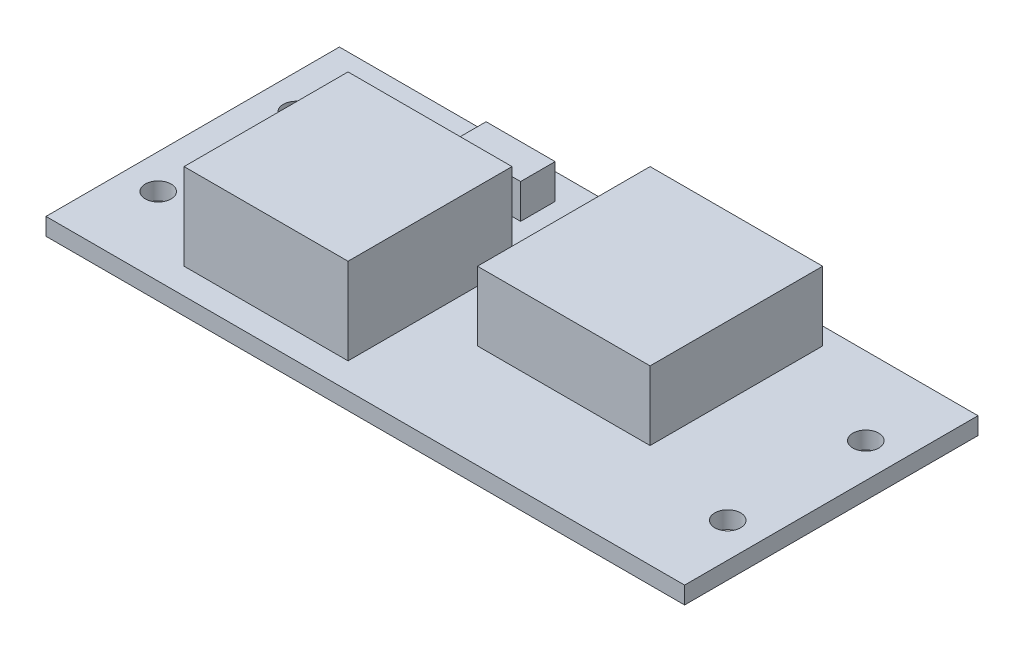
ISO-10303-21;
HEADER;
FILE_DESCRIPTION(('STEP AP214'),'2;1');
FILE_NAME('part.step','',(''),(''),'','','');
FILE_SCHEMA(('AUTOMOTIVE_DESIGN { 1 0 10303 214 1 1 1 1 }'));
ENDSEC;
DATA;
#1=APPLICATION_CONTEXT('core data for automotive mechanical design processes');
#2=APPLICATION_PROTOCOL_DEFINITION('international standard','automotive_design',2000,#1);
#3=PRODUCT_CONTEXT('',#1,'mechanical');
#4=PRODUCT('Part','Part','',(#3));
#5=PRODUCT_RELATED_PRODUCT_CATEGORY('part','',(#4));
#6=PRODUCT_DEFINITION_FORMATION('','',#4);
#7=PRODUCT_DEFINITION_CONTEXT('part definition',#1,'design');
#8=PRODUCT_DEFINITION('design','',#6,#7);
#9=PRODUCT_DEFINITION_SHAPE('','',#8);
#10=(LENGTH_UNIT() NAMED_UNIT(*) SI_UNIT(.MILLI.,.METRE.));
#11=(NAMED_UNIT(*) PLANE_ANGLE_UNIT() SI_UNIT($,.RADIAN.));
#12=(NAMED_UNIT(*) SI_UNIT($,.STERADIAN.) SOLID_ANGLE_UNIT());
#13=UNCERTAINTY_MEASURE_WITH_UNIT(LENGTH_MEASURE(1.E-05),#10,'distance_accuracy_value','');
#14=(GEOMETRIC_REPRESENTATION_CONTEXT(3) GLOBAL_UNCERTAINTY_ASSIGNED_CONTEXT((#13)) GLOBAL_UNIT_ASSIGNED_CONTEXT((#10,
#11,#12)) REPRESENTATION_CONTEXT('',''));
#15=CARTESIAN_POINT('',(0.,0.,0.));
#16=DIRECTION('',(0.,0.,1.));
#17=DIRECTION('',(1.,0.,0.));
#18=AXIS2_PLACEMENT_3D('',#15,#16,#17);
#19=CARTESIAN_POINT('',(18.5,-1.,0.));
#20=DIRECTION('',(-1.,0.,0.));
#21=DIRECTION('',(0.,0.,1.));
#22=AXIS2_PLACEMENT_3D('',#19,#20,#21);
#23=PLANE('',#22);
#24=DIRECTION('',(0.,0.,1.));
#25=VECTOR('',#24,1.);
#26=CARTESIAN_POINT('',(18.5,0.,0.));
#27=LINE('',#26,#25);
#28=CARTESIAN_POINT('',(18.5,0.,-8.5));
#29=VERTEX_POINT('',#28);
#30=CARTESIAN_POINT('',(18.5,0.,8.5));
#31=VERTEX_POINT('',#30);
#32=EDGE_CURVE('E282',#29,#31,#27,.T.);
#33=ORIENTED_EDGE('',*,*,#32,.T.);
#34=DIRECTION('',(0.,1.,0.));
#35=VECTOR('',#34,1.);
#36=CARTESIAN_POINT('',(18.5,-1.,8.5));
#37=LINE('',#36,#35);
#38=CARTESIAN_POINT('',(18.5,-1.,8.5));
#39=VERTEX_POINT('',#38);
#40=EDGE_CURVE('E11',#39,#31,#37,.T.);
#41=ORIENTED_EDGE('',*,*,#40,.F.);
#42=DIRECTION('',(0.,0.,1.));
#43=VECTOR('',#42,1.);
#44=CARTESIAN_POINT('',(18.5,-1.,0.));
#45=LINE('',#44,#43);
#46=CARTESIAN_POINT('',(18.5,-1.,-8.5));
#47=VERTEX_POINT('',#46);
#48=EDGE_CURVE('E261',#47,#39,#45,.T.);
#49=ORIENTED_EDGE('',*,*,#48,.F.);
#50=DIRECTION('',(0.,1.,0.));
#51=VECTOR('',#50,1.);
#52=CARTESIAN_POINT('',(18.5,-1.,-8.5));
#53=LINE('',#52,#51);
#54=EDGE_CURVE('E39',#47,#29,#53,.T.);
#55=ORIENTED_EDGE('',*,*,#54,.T.);
#56=EDGE_LOOP('',(#33,#41,#49,#55));
#57=FACE_BOUND('',#56,.T.);
#58=ADVANCED_FACE('F35',(#57),#23,.F.);
#59=CARTESIAN_POINT('',(0.,-1.,8.5));
#60=DIRECTION('',(0.,0.,1.));
#61=DIRECTION('',(1.,0.,0.));
#62=AXIS2_PLACEMENT_3D('',#59,#60,#61);
#63=PLANE('',#62);
#64=DIRECTION('',(1.,0.,0.));
#65=VECTOR('',#64,1.);
#66=CARTESIAN_POINT('',(0.,0.,8.5));
#67=LINE('',#66,#65);
#68=CARTESIAN_POINT('',(-18.5,0.,8.5));
#69=VERTEX_POINT('',#68);
#70=EDGE_CURVE('E252',#69,#31,#67,.T.);
#71=ORIENTED_EDGE('',*,*,#70,.F.);
#72=DIRECTION('',(0.,1.,0.));
#73=VECTOR('',#72,1.);
#74=CARTESIAN_POINT('',(-18.5,-1.,8.5));
#75=LINE('',#74,#73);
#76=CARTESIAN_POINT('',(-18.5,-1.,8.5));
#77=VERTEX_POINT('',#76);
#78=EDGE_CURVE('E44',#77,#69,#75,.T.);
#79=ORIENTED_EDGE('',*,*,#78,.F.);
#80=DIRECTION('',(1.,0.,0.));
#81=VECTOR('',#80,1.);
#82=CARTESIAN_POINT('',(0.,-1.,8.5));
#83=LINE('',#82,#81);
#84=EDGE_CURVE('E268',#77,#39,#83,.T.);
#85=ORIENTED_EDGE('',*,*,#84,.T.);
#86=ORIENTED_EDGE('',*,*,#40,.T.);
#87=EDGE_LOOP('',(#71,#79,#85,#86));
#88=FACE_BOUND('',#87,.T.);
#89=ADVANCED_FACE('F307',(#88),#63,.T.);
#90=CARTESIAN_POINT('',(-18.5,-1.,0.));
#91=DIRECTION('',(-1.,0.,0.));
#92=DIRECTION('',(0.,0.,1.));
#93=AXIS2_PLACEMENT_3D('',#90,#91,#92);
#94=PLANE('',#93);
#95=DIRECTION('',(0.,0.,1.));
#96=VECTOR('',#95,1.);
#97=CARTESIAN_POINT('',(-18.5,0.,0.));
#98=LINE('',#97,#96);
#99=CARTESIAN_POINT('',(-18.5,0.,-8.5));
#100=VERTEX_POINT('',#99);
#101=EDGE_CURVE('E287',#100,#69,#98,.T.);
#102=ORIENTED_EDGE('',*,*,#101,.F.);
#103=DIRECTION('',(0.,1.,0.));
#104=VECTOR('',#103,1.);
#105=CARTESIAN_POINT('',(-18.5,-1.,-8.5));
#106=LINE('',#105,#104);
#107=CARTESIAN_POINT('',(-18.5,-1.,-8.5));
#108=VERTEX_POINT('',#107);
#109=EDGE_CURVE('E292',#108,#100,#106,.T.);
#110=ORIENTED_EDGE('',*,*,#109,.F.);
#111=DIRECTION('',(0.,0.,1.));
#112=VECTOR('',#111,1.);
#113=CARTESIAN_POINT('',(-18.5,-1.,0.));
#114=LINE('',#113,#112);
#115=EDGE_CURVE('E265',#108,#77,#114,.T.);
#116=ORIENTED_EDGE('',*,*,#115,.T.);
#117=ORIENTED_EDGE('',*,*,#78,.T.);
#118=EDGE_LOOP('',(#102,#110,#116,#117));
#119=FACE_BOUND('',#118,.T.);
#120=ADVANCED_FACE('F329',(#119),#94,.T.);
#121=CARTESIAN_POINT('',(-16.5,-1.,-4.));
#122=DIRECTION('',(0.,1.,0.));
#123=DIRECTION('',(0.,0.,1.));
#124=AXIS2_PLACEMENT_3D('',#121,#122,#123);
#125=CYLINDRICAL_SURFACE('',#124,0.750000000000002);
#126=CARTESIAN_POINT('',(-16.5,-1.,-4.));
#127=DIRECTION('',(0.,1.,0.));
#128=DIRECTION('',(0.,0.,1.));
#129=AXIS2_PLACEMENT_3D('',#126,#127,#128);
#130=CIRCLE('',#129,0.750000000000002);
#131=CARTESIAN_POINT('',(-16.5,-1.,-3.25));
#132=VERTEX_POINT('',#131);
#133=EDGE_CURVE('E258',#132,#132,#130,.T.);
#134=ORIENTED_EDGE('',*,*,#133,.F.);
#135=EDGE_LOOP('',(#134));
#136=FACE_BOUND('',#135,.T.);
#137=CARTESIAN_POINT('',(-16.5,0.,-4.));
#138=DIRECTION('',(0.,1.,0.));
#139=DIRECTION('',(0.,0.,1.));
#140=AXIS2_PLACEMENT_3D('',#137,#138,#139);
#141=CIRCLE('',#140,0.750000000000002);
#142=CARTESIAN_POINT('',(-16.5,0.,-3.25));
#143=VERTEX_POINT('',#142);
#144=EDGE_CURVE('E279',#143,#143,#141,.T.);
#145=ORIENTED_EDGE('',*,*,#144,.T.);
#146=EDGE_LOOP('',(#145));
#147=FACE_BOUND('',#146,.T.);
#148=ADVANCED_FACE('F332',(#136,#147),#125,.F.);
#149=CARTESIAN_POINT('',(-16.5,-1.,4.));
#150=DIRECTION('',(0.,1.,0.));
#151=DIRECTION('',(0.,0.,1.));
#152=AXIS2_PLACEMENT_3D('',#149,#150,#151);
#153=CYLINDRICAL_SURFACE('',#152,0.750000000000002);
#154=CARTESIAN_POINT('',(-16.5,-1.,4.));
#155=DIRECTION('',(0.,1.,0.));
#156=DIRECTION('',(0.,0.,1.));
#157=AXIS2_PLACEMENT_3D('',#154,#155,#156);
#158=CIRCLE('',#157,0.750000000000002);
#159=CARTESIAN_POINT('',(-16.5,-1.,4.75));
#160=VERTEX_POINT('',#159);
#161=EDGE_CURVE('E255',#160,#160,#158,.T.);
#162=ORIENTED_EDGE('',*,*,#161,.F.);
#163=EDGE_LOOP('',(#162));
#164=FACE_BOUND('',#163,.T.);
#165=CARTESIAN_POINT('',(-16.5,0.,4.));
#166=DIRECTION('',(0.,1.,0.));
#167=DIRECTION('',(0.,0.,1.));
#168=AXIS2_PLACEMENT_3D('',#165,#166,#167);
#169=CIRCLE('',#168,0.750000000000002);
#170=CARTESIAN_POINT('',(-16.5,0.,4.75));
#171=VERTEX_POINT('',#170);
#172=EDGE_CURVE('E276',#171,#171,#169,.T.);
#173=ORIENTED_EDGE('',*,*,#172,.T.);
#174=EDGE_LOOP('',(#173));
#175=FACE_BOUND('',#174,.T.);
#176=ADVANCED_FACE('F335',(#164,#175),#153,.F.);
#177=CARTESIAN_POINT('',(16.5,-1.,4.00000000000001));
#178=DIRECTION('',(0.,1.,0.));
#179=DIRECTION('',(0.,0.,1.));
#180=AXIS2_PLACEMENT_3D('',#177,#178,#179);
#181=CYLINDRICAL_SURFACE('',#180,0.750000000000002);
#182=CARTESIAN_POINT('',(16.5,-1.,4.00000000000001));
#183=DIRECTION('',(0.,1.,0.));
#184=DIRECTION('',(0.,0.,1.));
#185=AXIS2_PLACEMENT_3D('',#182,#183,#184);
#186=CIRCLE('',#185,0.750000000000002);
#187=CARTESIAN_POINT('',(16.5,-1.,4.75000000000001));
#188=VERTEX_POINT('',#187);
#189=EDGE_CURVE('E251',#188,#188,#186,.T.);
#190=ORIENTED_EDGE('',*,*,#189,.F.);
#191=EDGE_LOOP('',(#190));
#192=FACE_BOUND('',#191,.T.);
#193=CARTESIAN_POINT('',(16.5,0.,4.00000000000001));
#194=DIRECTION('',(0.,1.,0.));
#195=DIRECTION('',(0.,0.,1.));
#196=AXIS2_PLACEMENT_3D('',#193,#194,#195);
#197=CIRCLE('',#196,0.750000000000002);
#198=CARTESIAN_POINT('',(16.5,0.,4.75000000000001));
#199=VERTEX_POINT('',#198);
#200=EDGE_CURVE('E273',#199,#199,#197,.T.);
#201=ORIENTED_EDGE('',*,*,#200,.T.);
#202=EDGE_LOOP('',(#201));
#203=FACE_BOUND('',#202,.T.);
#204=ADVANCED_FACE('F321',(#192,#203),#181,.F.);
#205=CARTESIAN_POINT('',(16.5,-1.,-4.00000000000001));
#206=DIRECTION('',(0.,1.,0.));
#207=DIRECTION('',(0.,0.,1.));
#208=AXIS2_PLACEMENT_3D('',#205,#206,#207);
#209=CYLINDRICAL_SURFACE('',#208,0.750000000000002);
#210=CARTESIAN_POINT('',(16.5,-1.,-4.00000000000001));
#211=DIRECTION('',(0.,1.,0.));
#212=DIRECTION('',(0.,0.,1.));
#213=AXIS2_PLACEMENT_3D('',#210,#211,#212);
#214=CIRCLE('',#213,0.750000000000002);
#215=CARTESIAN_POINT('',(16.5,-1.,-3.25));
#216=VERTEX_POINT('',#215);
#217=EDGE_CURVE('E248',#216,#216,#214,.T.);
#218=ORIENTED_EDGE('',*,*,#217,.F.);
#219=EDGE_LOOP('',(#218));
#220=FACE_BOUND('',#219,.T.);
#221=CARTESIAN_POINT('',(16.5,0.,-4.00000000000001));
#222=DIRECTION('',(0.,1.,0.));
#223=DIRECTION('',(0.,0.,1.));
#224=AXIS2_PLACEMENT_3D('',#221,#222,#223);
#225=CIRCLE('',#224,0.750000000000002);
#226=CARTESIAN_POINT('',(16.5,0.,-3.25));
#227=VERTEX_POINT('',#226);
#228=EDGE_CURVE('E247',#227,#227,#225,.T.);
#229=ORIENTED_EDGE('',*,*,#228,.T.);
#230=EDGE_LOOP('',(#229));
#231=FACE_BOUND('',#230,.T.);
#232=ADVANCED_FACE('F37',(#220,#231),#209,.F.);
#233=CARTESIAN_POINT('',(0.,-1.,-8.5));
#234=DIRECTION('',(0.,0.,1.));
#235=DIRECTION('',(1.,0.,0.));
#236=AXIS2_PLACEMENT_3D('',#233,#234,#235);
#237=PLANE('',#236);
#238=DIRECTION('',(1.,0.,0.));
#239=VECTOR('',#238,1.);
#240=CARTESIAN_POINT('',(0.,0.,-8.5));
#241=LINE('',#240,#239);
#242=EDGE_CURVE('E285',#100,#29,#241,.T.);
#243=ORIENTED_EDGE('',*,*,#242,.T.);
#244=ORIENTED_EDGE('',*,*,#54,.F.);
#245=DIRECTION('',(1.,0.,0.));
#246=VECTOR('',#245,1.);
#247=CARTESIAN_POINT('',(0.,-1.,-8.5));
#248=LINE('',#247,#246);
#249=EDGE_CURVE('E263',#108,#47,#248,.T.);
#250=ORIENTED_EDGE('',*,*,#249,.F.);
#251=ORIENTED_EDGE('',*,*,#109,.T.);
#252=EDGE_LOOP('',(#243,#244,#250,#251));
#253=FACE_BOUND('',#252,.T.);
#254=ADVANCED_FACE('F312',(#253),#237,.F.);
#255=CARTESIAN_POINT('',(0.,-1.,0.));
#256=DIRECTION('',(0.,1.,0.));
#257=DIRECTION('',(0.,0.,1.));
#258=AXIS2_PLACEMENT_3D('',#255,#256,#257);
#259=PLANE('',#258);
#260=ORIENTED_EDGE('',*,*,#217,.T.);
#261=EDGE_LOOP('',(#260));
#262=FACE_BOUND('',#261,.T.);
#263=ORIENTED_EDGE('',*,*,#189,.T.);
#264=EDGE_LOOP('',(#263));
#265=FACE_BOUND('',#264,.T.);
#266=ORIENTED_EDGE('',*,*,#161,.T.);
#267=EDGE_LOOP('',(#266));
#268=FACE_BOUND('',#267,.T.);
#269=ORIENTED_EDGE('',*,*,#133,.T.);
#270=EDGE_LOOP('',(#269));
#271=FACE_BOUND('',#270,.T.);
#272=ORIENTED_EDGE('',*,*,#48,.T.);
#273=ORIENTED_EDGE('',*,*,#84,.F.);
#274=ORIENTED_EDGE('',*,*,#115,.F.);
#275=ORIENTED_EDGE('',*,*,#249,.T.);
#276=EDGE_LOOP('',(#272,#273,#274,#275));
#277=FACE_BOUND('',#276,.T.);
#278=ADVANCED_FACE('F311',(#262,#265,#268,#271,#277),#259,.F.);
#279=CARTESIAN_POINT('',(0.,0.,0.));
#280=DIRECTION('',(0.,1.,0.));
#281=DIRECTION('',(0.,0.,1.));
#282=AXIS2_PLACEMENT_3D('',#279,#280,#281);
#283=PLANE('',#282);
#284=DIRECTION('',(0.,0.,1.));
#285=VECTOR('',#284,1.);
#286=CARTESIAN_POINT('',(-4.5,0.,0.));
#287=LINE('',#286,#285);
#288=CARTESIAN_POINT('',(-4.5,0.,-7.));
#289=VERTEX_POINT('',#288);
#290=CARTESIAN_POINT('',(-4.5,0.,-5.));
#291=VERTEX_POINT('',#290);
#292=EDGE_CURVE('E158',#289,#291,#287,.T.);
#293=ORIENTED_EDGE('',*,*,#292,.T.);
#294=DIRECTION('',(1.,0.,0.));
#295=VECTOR('',#294,1.);
#296=CARTESIAN_POINT('',(0.,0.,-5.));
#297=LINE('',#296,#295);
#298=CARTESIAN_POINT('',(-8.5,0.,-5.));
#299=VERTEX_POINT('',#298);
#300=EDGE_CURVE('E172',#299,#291,#297,.T.);
#301=ORIENTED_EDGE('',*,*,#300,.F.);
#302=DIRECTION('',(0.,0.,1.));
#303=VECTOR('',#302,1.);
#304=CARTESIAN_POINT('',(-8.49999999999999,0.,0.));
#305=LINE('',#304,#303);
#306=CARTESIAN_POINT('',(-8.5,0.,-7.));
#307=VERTEX_POINT('',#306);
#308=EDGE_CURVE('E185',#307,#299,#305,.T.);
#309=ORIENTED_EDGE('',*,*,#308,.F.);
#310=DIRECTION('',(1.,0.,0.));
#311=VECTOR('',#310,1.);
#312=CARTESIAN_POINT('',(0.,0.,-7.));
#313=LINE('',#312,#311);
#314=EDGE_CURVE('E183',#307,#289,#313,.T.);
#315=ORIENTED_EDGE('',*,*,#314,.T.);
#316=EDGE_LOOP('',(#293,#301,#309,#315));
#317=FACE_BOUND('',#316,.T.);
#318=DIRECTION('',(0.,0.,1.));
#319=VECTOR('',#318,1.);
#320=CARTESIAN_POINT('',(-2.5,0.,0.));
#321=LINE('',#320,#319);
#322=CARTESIAN_POINT('',(-2.5,0.,-2.5));
#323=VERTEX_POINT('',#322);
#324=CARTESIAN_POINT('',(-2.5,0.,7.));
#325=VERTEX_POINT('',#324);
#326=EDGE_CURVE('E163',#323,#325,#321,.T.);
#327=ORIENTED_EDGE('',*,*,#326,.T.);
#328=DIRECTION('',(1.,0.,0.));
#329=VECTOR('',#328,1.);
#330=CARTESIAN_POINT('',(0.,0.,7.));
#331=LINE('',#330,#329);
#332=CARTESIAN_POINT('',(-12.,0.,7.));
#333=VERTEX_POINT('',#332);
#334=EDGE_CURVE('E195',#333,#325,#331,.T.);
#335=ORIENTED_EDGE('',*,*,#334,.F.);
#336=DIRECTION('',(0.,0.,1.));
#337=VECTOR('',#336,1.);
#338=CARTESIAN_POINT('',(-12.,0.,0.));
#339=LINE('',#338,#337);
#340=CARTESIAN_POINT('',(-12.,0.,-2.5));
#341=VERTEX_POINT('',#340);
#342=EDGE_CURVE('E208',#341,#333,#339,.T.);
#343=ORIENTED_EDGE('',*,*,#342,.F.);
#344=DIRECTION('',(1.,0.,0.));
#345=VECTOR('',#344,1.);
#346=CARTESIAN_POINT('',(0.,0.,-2.5));
#347=LINE('',#346,#345);
#348=EDGE_CURVE('E205',#341,#323,#347,.T.);
#349=ORIENTED_EDGE('',*,*,#348,.T.);
#350=EDGE_LOOP('',(#327,#335,#343,#349));
#351=FACE_BOUND('',#350,.T.);
#352=DIRECTION('',(0.,0.,1.));
#353=VECTOR('',#352,1.);
#354=CARTESIAN_POINT('',(10.5,0.,0.));
#355=LINE('',#354,#353);
#356=CARTESIAN_POINT('',(10.5,0.,-7.5));
#357=VERTEX_POINT('',#356);
#358=CARTESIAN_POINT('',(10.5,0.,2.5));
#359=VERTEX_POINT('',#358);
#360=EDGE_CURVE('E217',#357,#359,#355,.T.);
#361=ORIENTED_EDGE('',*,*,#360,.T.);
#362=DIRECTION('',(1.,0.,0.));
#363=VECTOR('',#362,1.);
#364=CARTESIAN_POINT('',(0.,0.,2.5));
#365=LINE('',#364,#363);
#366=CARTESIAN_POINT('',(0.500000000000002,0.,2.5));
#367=VERTEX_POINT('',#366);
#368=EDGE_CURVE('E222',#367,#359,#365,.T.);
#369=ORIENTED_EDGE('',*,*,#368,.F.);
#370=DIRECTION('',(0.,0.,1.));
#371=VECTOR('',#370,1.);
#372=CARTESIAN_POINT('',(0.500000000000001,0.,0.));
#373=LINE('',#372,#371);
#374=CARTESIAN_POINT('',(0.5,0.,-7.5));
#375=VERTEX_POINT('',#374);
#376=EDGE_CURVE('E235',#375,#367,#373,.T.);
#377=ORIENTED_EDGE('',*,*,#376,.F.);
#378=DIRECTION('',(1.,0.,0.));
#379=VECTOR('',#378,1.);
#380=CARTESIAN_POINT('',(0.,0.,-7.5));
#381=LINE('',#380,#379);
#382=EDGE_CURVE('E232',#375,#357,#381,.T.);
#383=ORIENTED_EDGE('',*,*,#382,.T.);
#384=EDGE_LOOP('',(#361,#369,#377,#383));
#385=FACE_BOUND('',#384,.T.);
#386=ORIENTED_EDGE('',*,*,#228,.F.);
#387=EDGE_LOOP('',(#386));
#388=FACE_BOUND('',#387,.T.);
#389=ORIENTED_EDGE('',*,*,#200,.F.);
#390=EDGE_LOOP('',(#389));
#391=FACE_BOUND('',#390,.T.);
#392=ORIENTED_EDGE('',*,*,#172,.F.);
#393=EDGE_LOOP('',(#392));
#394=FACE_BOUND('',#393,.T.);
#395=ORIENTED_EDGE('',*,*,#144,.F.);
#396=EDGE_LOOP('',(#395));
#397=FACE_BOUND('',#396,.T.);
#398=ORIENTED_EDGE('',*,*,#32,.F.);
#399=ORIENTED_EDGE('',*,*,#242,.F.);
#400=ORIENTED_EDGE('',*,*,#101,.T.);
#401=ORIENTED_EDGE('',*,*,#70,.T.);
#402=EDGE_LOOP('',(#398,#399,#400,#401));
#403=FACE_BOUND('',#402,.T.);
#404=ADVANCED_FACE('F303',(#317,#351,#385,#388,#391,#394,#397,#403),#283,.T.);
#405=CARTESIAN_POINT('',(10.5,4.,0.));
#406=DIRECTION('',(1.,0.,0.));
#407=DIRECTION('',(0.,0.,-1.));
#408=AXIS2_PLACEMENT_3D('',#405,#406,#407);
#409=PLANE('',#408);
#410=ORIENTED_EDGE('',*,*,#360,.F.);
#411=DIRECTION('',(0.,-1.,0.));
#412=VECTOR('',#411,1.);
#413=CARTESIAN_POINT('',(10.5,4.,-7.5));
#414=LINE('',#413,#412);
#415=CARTESIAN_POINT('',(10.5,4.,-7.5));
#416=VERTEX_POINT('',#415);
#417=EDGE_CURVE('E245',#416,#357,#414,.T.);
#418=ORIENTED_EDGE('',*,*,#417,.F.);
#419=DIRECTION('',(0.,0.,1.));
#420=VECTOR('',#419,1.);
#421=CARTESIAN_POINT('',(10.5,4.,0.));
#422=LINE('',#421,#420);
#423=CARTESIAN_POINT('',(10.5,4.,2.5));
#424=VERTEX_POINT('',#423);
#425=EDGE_CURVE('E218',#416,#424,#422,.T.);
#426=ORIENTED_EDGE('',*,*,#425,.T.);
#427=DIRECTION('',(0.,-1.,0.));
#428=VECTOR('',#427,1.);
#429=CARTESIAN_POINT('',(10.5,4.,2.5));
#430=LINE('',#429,#428);
#431=EDGE_CURVE('E229',#424,#359,#430,.T.);
#432=ORIENTED_EDGE('',*,*,#431,.T.);
#433=EDGE_LOOP('',(#410,#418,#426,#432));
#434=FACE_BOUND('',#433,.T.);
#435=ADVANCED_FACE('F349',(#434),#409,.T.);
#436=CARTESIAN_POINT('',(0.,4.,-7.5));
#437=DIRECTION('',(0.,0.,-1.));
#438=DIRECTION('',(-1.,0.,0.));
#439=AXIS2_PLACEMENT_3D('',#436,#437,#438);
#440=PLANE('',#439);
#441=ORIENTED_EDGE('',*,*,#382,.F.);
#442=DIRECTION('',(0.,-1.,0.));
#443=VECTOR('',#442,1.);
#444=CARTESIAN_POINT('',(0.5,4.,-7.5));
#445=LINE('',#444,#443);
#446=CARTESIAN_POINT('',(0.5,4.,-7.5));
#447=VERTEX_POINT('',#446);
#448=EDGE_CURVE('E243',#447,#375,#445,.T.);
#449=ORIENTED_EDGE('',*,*,#448,.F.);
#450=DIRECTION('',(1.,0.,0.));
#451=VECTOR('',#450,1.);
#452=CARTESIAN_POINT('',(0.,4.,-7.5));
#453=LINE('',#452,#451);
#454=EDGE_CURVE('E221',#447,#416,#453,.T.);
#455=ORIENTED_EDGE('',*,*,#454,.T.);
#456=ORIENTED_EDGE('',*,*,#417,.T.);
#457=EDGE_LOOP('',(#441,#449,#455,#456));
#458=FACE_BOUND('',#457,.T.);
#459=ADVANCED_FACE('F360',(#458),#440,.T.);
#460=CARTESIAN_POINT('',(0.500000000000001,4.,0.));
#461=DIRECTION('',(1.,0.,0.));
#462=DIRECTION('',(0.,0.,-1.));
#463=AXIS2_PLACEMENT_3D('',#460,#461,#462);
#464=PLANE('',#463);
#465=ORIENTED_EDGE('',*,*,#376,.T.);
#466=DIRECTION('',(0.,-1.,0.));
#467=VECTOR('',#466,1.);
#468=CARTESIAN_POINT('',(0.500000000000002,4.,2.5));
#469=LINE('',#468,#467);
#470=CARTESIAN_POINT('',(0.500000000000002,4.,2.5));
#471=VERTEX_POINT('',#470);
#472=EDGE_CURVE('E241',#471,#367,#469,.T.);
#473=ORIENTED_EDGE('',*,*,#472,.F.);
#474=DIRECTION('',(0.,0.,1.));
#475=VECTOR('',#474,1.);
#476=CARTESIAN_POINT('',(0.500000000000001,4.,0.));
#477=LINE('',#476,#475);
#478=EDGE_CURVE('E225',#447,#471,#477,.T.);
#479=ORIENTED_EDGE('',*,*,#478,.F.);
#480=ORIENTED_EDGE('',*,*,#448,.T.);
#481=EDGE_LOOP('',(#465,#473,#479,#480));
#482=FACE_BOUND('',#481,.T.);
#483=ADVANCED_FACE('F414',(#482),#464,.F.);
#484=CARTESIAN_POINT('',(0.,4.,2.5));
#485=DIRECTION('',(0.,0.,-1.));
#486=DIRECTION('',(-1.,0.,0.));
#487=AXIS2_PLACEMENT_3D('',#484,#485,#486);
#488=PLANE('',#487);
#489=ORIENTED_EDGE('',*,*,#368,.T.);
#490=ORIENTED_EDGE('',*,*,#431,.F.);
#491=DIRECTION('',(1.,0.,0.));
#492=VECTOR('',#491,1.);
#493=CARTESIAN_POINT('',(0.,4.,2.5));
#494=LINE('',#493,#492);
#495=EDGE_CURVE('E227',#471,#424,#494,.T.);
#496=ORIENTED_EDGE('',*,*,#495,.F.);
#497=ORIENTED_EDGE('',*,*,#472,.T.);
#498=EDGE_LOOP('',(#489,#490,#496,#497));
#499=FACE_BOUND('',#498,.T.);
#500=ADVANCED_FACE('F424',(#499),#488,.F.);
#501=CARTESIAN_POINT('',(0.,4.,0.));
#502=DIRECTION('',(0.,1.,0.));
#503=DIRECTION('',(0.,0.,1.));
#504=AXIS2_PLACEMENT_3D('',#501,#502,#503);
#505=PLANE('',#504);
#506=ORIENTED_EDGE('',*,*,#425,.F.);
#507=ORIENTED_EDGE('',*,*,#454,.F.);
#508=ORIENTED_EDGE('',*,*,#478,.T.);
#509=ORIENTED_EDGE('',*,*,#495,.T.);
#510=EDGE_LOOP('',(#506,#507,#508,#509));
#511=FACE_BOUND('',#510,.T.);
#512=ADVANCED_FACE('F434',(#511),#505,.T.);
#513=CARTESIAN_POINT('',(-2.5,5.,0.));
#514=DIRECTION('',(1.,0.,0.));
#515=DIRECTION('',(0.,0.,-1.));
#516=AXIS2_PLACEMENT_3D('',#513,#514,#515);
#517=PLANE('',#516);
#518=ORIENTED_EDGE('',*,*,#326,.F.);
#519=DIRECTION('',(0.,-1.,0.));
#520=VECTOR('',#519,1.);
#521=CARTESIAN_POINT('',(-2.5,5.,-2.5));
#522=LINE('',#521,#520);
#523=CARTESIAN_POINT('',(-2.5,5.,-2.5));
#524=VERTEX_POINT('',#523);
#525=EDGE_CURVE('E215',#524,#323,#522,.T.);
#526=ORIENTED_EDGE('',*,*,#525,.F.);
#527=DIRECTION('',(0.,0.,1.));
#528=VECTOR('',#527,1.);
#529=CARTESIAN_POINT('',(-2.5,5.,0.));
#530=LINE('',#529,#528);
#531=CARTESIAN_POINT('',(-2.5,5.,7.));
#532=VERTEX_POINT('',#531);
#533=EDGE_CURVE('E191',#524,#532,#530,.T.);
#534=ORIENTED_EDGE('',*,*,#533,.T.);
#535=DIRECTION('',(0.,-1.,0.));
#536=VECTOR('',#535,1.);
#537=CARTESIAN_POINT('',(-2.5,5.,7.));
#538=LINE('',#537,#536);
#539=EDGE_CURVE('E202',#532,#325,#538,.T.);
#540=ORIENTED_EDGE('',*,*,#539,.T.);
#541=EDGE_LOOP('',(#518,#526,#534,#540));
#542=FACE_BOUND('',#541,.T.);
#543=ADVANCED_FACE('F444',(#542),#517,.T.);
#544=CARTESIAN_POINT('',(0.,5.,-2.5));
#545=DIRECTION('',(0.,0.,-1.));
#546=DIRECTION('',(-1.,0.,0.));
#547=AXIS2_PLACEMENT_3D('',#544,#545,#546);
#548=PLANE('',#547);
#549=ORIENTED_EDGE('',*,*,#348,.F.);
#550=DIRECTION('',(0.,-1.,0.));
#551=VECTOR('',#550,1.);
#552=CARTESIAN_POINT('',(-12.,5.,-2.5));
#553=LINE('',#552,#551);
#554=CARTESIAN_POINT('',(-12.,5.,-2.5));
#555=VERTEX_POINT('',#554);
#556=EDGE_CURVE('E213',#555,#341,#553,.T.);
#557=ORIENTED_EDGE('',*,*,#556,.F.);
#558=DIRECTION('',(1.,0.,0.));
#559=VECTOR('',#558,1.);
#560=CARTESIAN_POINT('',(0.,5.,-2.5));
#561=LINE('',#560,#559);
#562=EDGE_CURVE('E194',#555,#524,#561,.T.);
#563=ORIENTED_EDGE('',*,*,#562,.T.);
#564=ORIENTED_EDGE('',*,*,#525,.T.);
#565=EDGE_LOOP('',(#549,#557,#563,#564));
#566=FACE_BOUND('',#565,.T.);
#567=ADVANCED_FACE('F454',(#566),#548,.T.);
#568=CARTESIAN_POINT('',(-12.,5.,0.));
#569=DIRECTION('',(1.,0.,0.));
#570=DIRECTION('',(0.,0.,-1.));
#571=AXIS2_PLACEMENT_3D('',#568,#569,#570);
#572=PLANE('',#571);
#573=ORIENTED_EDGE('',*,*,#342,.T.);
#574=DIRECTION('',(0.,-1.,0.));
#575=VECTOR('',#574,1.);
#576=CARTESIAN_POINT('',(-12.,5.,7.));
#577=LINE('',#576,#575);
#578=CARTESIAN_POINT('',(-12.,5.,7.));
#579=VERTEX_POINT('',#578);
#580=EDGE_CURVE('E60',#579,#333,#577,.T.);
#581=ORIENTED_EDGE('',*,*,#580,.F.);
#582=DIRECTION('',(0.,0.,1.));
#583=VECTOR('',#582,1.);
#584=CARTESIAN_POINT('',(-12.,5.,0.));
#585=LINE('',#584,#583);
#586=EDGE_CURVE('E198',#555,#579,#585,.T.);
#587=ORIENTED_EDGE('',*,*,#586,.F.);
#588=ORIENTED_EDGE('',*,*,#556,.T.);
#589=EDGE_LOOP('',(#573,#581,#587,#588));
#590=FACE_BOUND('',#589,.T.);
#591=ADVANCED_FACE('F464',(#590),#572,.F.);
#592=CARTESIAN_POINT('',(0.,5.,7.));
#593=DIRECTION('',(0.,0.,-1.));
#594=DIRECTION('',(-1.,0.,0.));
#595=AXIS2_PLACEMENT_3D('',#592,#593,#594);
#596=PLANE('',#595);
#597=ORIENTED_EDGE('',*,*,#334,.T.);
#598=ORIENTED_EDGE('',*,*,#539,.F.);
#599=DIRECTION('',(1.,0.,0.));
#600=VECTOR('',#599,1.);
#601=CARTESIAN_POINT('',(0.,5.,7.));
#602=LINE('',#601,#600);
#603=EDGE_CURVE('E200',#579,#532,#602,.T.);
#604=ORIENTED_EDGE('',*,*,#603,.F.);
#605=ORIENTED_EDGE('',*,*,#580,.T.);
#606=EDGE_LOOP('',(#597,#598,#604,#605));
#607=FACE_BOUND('',#606,.T.);
#608=ADVANCED_FACE('F474',(#607),#596,.F.);
#609=CARTESIAN_POINT('',(0.,5.,0.));
#610=DIRECTION('',(0.,1.,0.));
#611=DIRECTION('',(0.,0.,1.));
#612=AXIS2_PLACEMENT_3D('',#609,#610,#611);
#613=PLANE('',#612);
#614=ORIENTED_EDGE('',*,*,#533,.F.);
#615=ORIENTED_EDGE('',*,*,#562,.F.);
#616=ORIENTED_EDGE('',*,*,#586,.T.);
#617=ORIENTED_EDGE('',*,*,#603,.T.);
#618=EDGE_LOOP('',(#614,#615,#616,#617));
#619=FACE_BOUND('',#618,.T.);
#620=ADVANCED_FACE('F484',(#619),#613,.T.);
#621=CARTESIAN_POINT('',(-4.5,2.,0.));
#622=DIRECTION('',(1.,0.,0.));
#623=DIRECTION('',(0.,0.,-1.));
#624=AXIS2_PLACEMENT_3D('',#621,#622,#623);
#625=PLANE('',#624);
#626=ORIENTED_EDGE('',*,*,#292,.F.);
#627=DIRECTION('',(0.,-1.,0.));
#628=VECTOR('',#627,1.);
#629=CARTESIAN_POINT('',(-4.5,2.,-7.));
#630=LINE('',#629,#628);
#631=CARTESIAN_POINT('',(-4.5,2.,-7.));
#632=VERTEX_POINT('',#631);
#633=EDGE_CURVE('E153',#632,#289,#630,.T.);
#634=ORIENTED_EDGE('',*,*,#633,.F.);
#635=DIRECTION('',(0.,0.,1.));
#636=VECTOR('',#635,1.);
#637=CARTESIAN_POINT('',(-4.5,2.,0.));
#638=LINE('',#637,#636);
#639=CARTESIAN_POINT('',(-4.5,2.,-5.));
#640=VERTEX_POINT('',#639);
#641=EDGE_CURVE('E156',#632,#640,#638,.T.);
#642=ORIENTED_EDGE('',*,*,#641,.T.);
#643=DIRECTION('',(0.,-1.,0.));
#644=VECTOR('',#643,1.);
#645=CARTESIAN_POINT('',(-4.5,2.,-5.));
#646=LINE('',#645,#644);
#647=EDGE_CURVE('E181',#640,#291,#646,.T.);
#648=ORIENTED_EDGE('',*,*,#647,.T.);
#649=EDGE_LOOP('',(#626,#634,#642,#648));
#650=FACE_BOUND('',#649,.T.);
#651=ADVANCED_FACE('F155',(#650),#625,.T.);
#652=CARTESIAN_POINT('',(0.,2.,-7.));
#653=DIRECTION('',(0.,0.,-1.));
#654=DIRECTION('',(-1.,0.,0.));
#655=AXIS2_PLACEMENT_3D('',#652,#653,#654);
#656=PLANE('',#655);
#657=ORIENTED_EDGE('',*,*,#314,.F.);
#658=DIRECTION('',(0.,-1.,0.));
#659=VECTOR('',#658,1.);
#660=CARTESIAN_POINT('',(-8.5,2.,-7.));
#661=LINE('',#660,#659);
#662=CARTESIAN_POINT('',(-8.5,2.,-7.));
#663=VERTEX_POINT('',#662);
#664=EDGE_CURVE('E164',#663,#307,#661,.T.);
#665=ORIENTED_EDGE('',*,*,#664,.F.);
#666=DIRECTION('',(1.,0.,0.));
#667=VECTOR('',#666,1.);
#668=CARTESIAN_POINT('',(0.,2.,-7.));
#669=LINE('',#668,#667);
#670=EDGE_CURVE('E169',#663,#632,#669,.T.);
#671=ORIENTED_EDGE('',*,*,#670,.T.);
#672=ORIENTED_EDGE('',*,*,#633,.T.);
#673=EDGE_LOOP('',(#657,#665,#671,#672));
#674=FACE_BOUND('',#673,.T.);
#675=ADVANCED_FACE('F174',(#674),#656,.T.);
#676=CARTESIAN_POINT('',(-8.49999999999999,2.,0.));
#677=DIRECTION('',(1.,0.,0.));
#678=DIRECTION('',(0.,0.,-1.));
#679=AXIS2_PLACEMENT_3D('',#676,#677,#678);
#680=PLANE('',#679);
#681=ORIENTED_EDGE('',*,*,#308,.T.);
#682=DIRECTION('',(0.,-1.,0.));
#683=VECTOR('',#682,1.);
#684=CARTESIAN_POINT('',(-8.5,2.,-5.));
#685=LINE('',#684,#683);
#686=CARTESIAN_POINT('',(-8.5,2.,-5.));
#687=VERTEX_POINT('',#686);
#688=EDGE_CURVE('E52',#687,#299,#685,.T.);
#689=ORIENTED_EDGE('',*,*,#688,.F.);
#690=DIRECTION('',(0.,0.,1.));
#691=VECTOR('',#690,1.);
#692=CARTESIAN_POINT('',(-8.49999999999999,2.,0.));
#693=LINE('',#692,#691);
#694=EDGE_CURVE('E176',#663,#687,#693,.T.);
#695=ORIENTED_EDGE('',*,*,#694,.F.);
#696=ORIENTED_EDGE('',*,*,#664,.T.);
#697=EDGE_LOOP('',(#681,#689,#695,#696));
#698=FACE_BOUND('',#697,.T.);
#699=ADVANCED_FACE('F513',(#698),#680,.F.);
#700=CARTESIAN_POINT('',(0.,2.,-5.));
#701=DIRECTION('',(0.,0.,-1.));
#702=DIRECTION('',(-1.,0.,0.));
#703=AXIS2_PLACEMENT_3D('',#700,#701,#702);
#704=PLANE('',#703);
#705=ORIENTED_EDGE('',*,*,#300,.T.);
#706=ORIENTED_EDGE('',*,*,#647,.F.);
#707=DIRECTION('',(1.,0.,0.));
#708=VECTOR('',#707,1.);
#709=CARTESIAN_POINT('',(0.,2.,-5.));
#710=LINE('',#709,#708);
#711=EDGE_CURVE('E170',#687,#640,#710,.T.);
#712=ORIENTED_EDGE('',*,*,#711,.F.);
#713=ORIENTED_EDGE('',*,*,#688,.T.);
#714=EDGE_LOOP('',(#705,#706,#712,#713));
#715=FACE_BOUND('',#714,.T.);
#716=ADVANCED_FACE('F522',(#715),#704,.F.);
#717=CARTESIAN_POINT('',(0.,2.,0.));
#718=DIRECTION('',(0.,1.,0.));
#719=DIRECTION('',(0.,0.,1.));
#720=AXIS2_PLACEMENT_3D('',#717,#718,#719);
#721=PLANE('',#720);
#722=ORIENTED_EDGE('',*,*,#641,.F.);
#723=ORIENTED_EDGE('',*,*,#670,.F.);
#724=ORIENTED_EDGE('',*,*,#694,.T.);
#725=ORIENTED_EDGE('',*,*,#711,.T.);
#726=EDGE_LOOP('',(#722,#723,#724,#725));
#727=FACE_BOUND('',#726,.T.);
#728=ADVANCED_FACE('F168',(#727),#721,.T.);
#729=CLOSED_SHELL('',(#58,#89,#120,#148,#176,#204,#232,#254,#278,#404,#435,#459,#483,#500,#512,
#543,#567,#591,#608,#620,#651,#675,#699,#716,#728));
#730=MANIFOLD_SOLID_BREP('B2',#729);
#731=ADVANCED_BREP_SHAPE_REPRESENTATION('',(#18,#730),#14);
#732=SHAPE_DEFINITION_REPRESENTATION(#9,#731);
ENDSEC;
END-ISO-10303-21;
